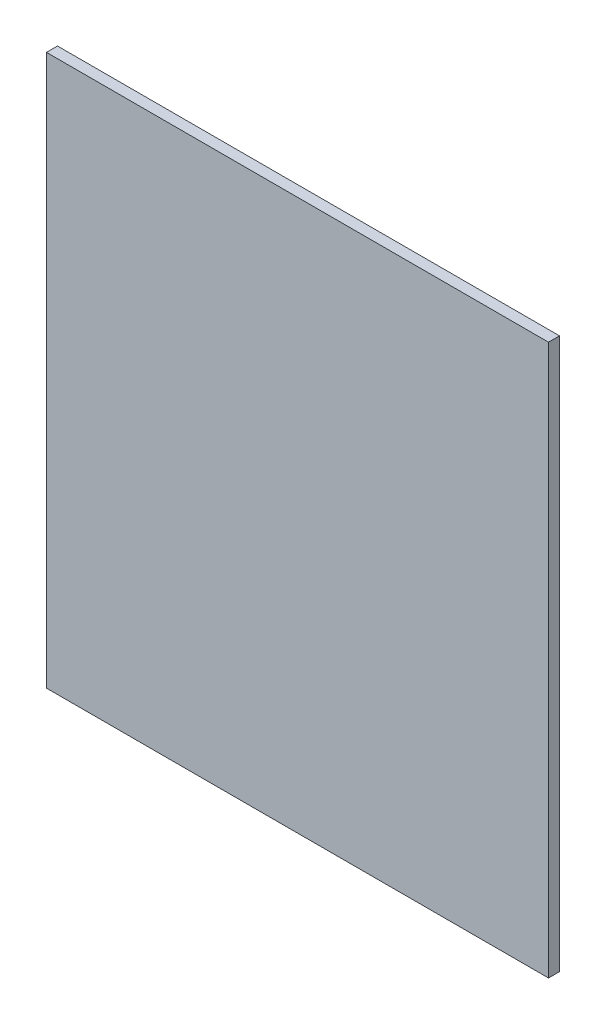
ISO-10303-21;
HEADER;
FILE_DESCRIPTION(('STEP AP214'),'2;1');
FILE_NAME('part.step','',(''),(''),'','','');
FILE_SCHEMA(('AUTOMOTIVE_DESIGN { 1 0 10303 214 1 1 1 1 }'));
ENDSEC;
DATA;
#1=APPLICATION_CONTEXT('core data for automotive mechanical design processes');
#2=APPLICATION_PROTOCOL_DEFINITION('international standard','automotive_design',2000,#1);
#3=PRODUCT_CONTEXT('',#1,'mechanical');
#4=PRODUCT('Part','Part','',(#3));
#5=PRODUCT_RELATED_PRODUCT_CATEGORY('part','',(#4));
#6=PRODUCT_DEFINITION_FORMATION('','',#4);
#7=PRODUCT_DEFINITION_CONTEXT('part definition',#1,'design');
#8=PRODUCT_DEFINITION('design','',#6,#7);
#9=PRODUCT_DEFINITION_SHAPE('','',#8);
#10=(LENGTH_UNIT() NAMED_UNIT(*) SI_UNIT(.MILLI.,.METRE.));
#11=(NAMED_UNIT(*) PLANE_ANGLE_UNIT() SI_UNIT($,.RADIAN.));
#12=(NAMED_UNIT(*) SI_UNIT($,.STERADIAN.) SOLID_ANGLE_UNIT());
#13=UNCERTAINTY_MEASURE_WITH_UNIT(LENGTH_MEASURE(1.E-05),#10,'distance_accuracy_value','');
#14=(GEOMETRIC_REPRESENTATION_CONTEXT(3) GLOBAL_UNCERTAINTY_ASSIGNED_CONTEXT((#13)) GLOBAL_UNIT_ASSIGNED_CONTEXT((#10,
#11,#12)) REPRESENTATION_CONTEXT('',''));
#15=CARTESIAN_POINT('',(0.,0.,0.));
#16=DIRECTION('',(0.,0.,1.));
#17=DIRECTION('',(1.,0.,0.));
#18=AXIS2_PLACEMENT_3D('',#15,#16,#17);
#19=CARTESIAN_POINT('',(-68.375,75.,3.));
#20=DIRECTION('',(1.,0.,0.));
#21=DIRECTION('',(0.,1.,0.));
#22=AXIS2_PLACEMENT_3D('',#19,#20,#21);
#23=PLANE('',#22);
#24=DIRECTION('',(0.,-1.,0.));
#25=VECTOR('',#24,1.);
#26=CARTESIAN_POINT('',(-68.375,75.,0.));
#27=LINE('',#26,#25);
#28=CARTESIAN_POINT('',(-68.375,75.,0.));
#29=VERTEX_POINT('',#28);
#30=CARTESIAN_POINT('',(-68.375,-75.,0.));
#31=VERTEX_POINT('',#30);
#32=EDGE_CURVE('E107',#29,#31,#27,.T.);
#33=ORIENTED_EDGE('',*,*,#32,.T.);
#34=DIRECTION('',(0.,0.,-1.));
#35=VECTOR('',#34,1.);
#36=CARTESIAN_POINT('',(-68.375,-75.,3.));
#37=LINE('',#36,#35);
#38=CARTESIAN_POINT('',(-68.375,-75.,3.));
#39=VERTEX_POINT('',#38);
#40=EDGE_CURVE('E11',#39,#31,#37,.T.);
#41=ORIENTED_EDGE('',*,*,#40,.F.);
#42=DIRECTION('',(0.,-1.,0.));
#43=VECTOR('',#42,1.);
#44=CARTESIAN_POINT('',(-68.375,75.,3.));
#45=LINE('',#44,#43);
#46=CARTESIAN_POINT('',(-68.375,75.,3.));
#47=VERTEX_POINT('',#46);
#48=EDGE_CURVE('E91',#47,#39,#45,.T.);
#49=ORIENTED_EDGE('',*,*,#48,.F.);
#50=DIRECTION('',(0.,0.,-1.));
#51=VECTOR('',#50,1.);
#52=CARTESIAN_POINT('',(-68.375,75.,3.));
#53=LINE('',#52,#51);
#54=EDGE_CURVE('E103',#47,#29,#53,.T.);
#55=ORIENTED_EDGE('',*,*,#54,.T.);
#56=EDGE_LOOP('',(#33,#41,#49,#55));
#57=FACE_BOUND('',#56,.T.);
#58=ADVANCED_FACE('F39',(#57),#23,.F.);
#59=CARTESIAN_POINT('',(-68.375,-75.,3.));
#60=DIRECTION('',(0.,1.,0.));
#61=DIRECTION('',(0.,0.,1.));
#62=AXIS2_PLACEMENT_3D('',#59,#60,#61);
#63=PLANE('',#62);
#64=DIRECTION('',(1.,0.,0.));
#65=VECTOR('',#64,1.);
#66=CARTESIAN_POINT('',(-68.375,-75.,0.));
#67=LINE('',#66,#65);
#68=CARTESIAN_POINT('',(68.375,-75.,0.));
#69=VERTEX_POINT('',#68);
#70=EDGE_CURVE('E96',#31,#69,#67,.T.);
#71=ORIENTED_EDGE('',*,*,#70,.T.);
#72=DIRECTION('',(0.,0.,-1.));
#73=VECTOR('',#72,1.);
#74=CARTESIAN_POINT('',(68.375,-75.,3.));
#75=LINE('',#74,#73);
#76=CARTESIAN_POINT('',(68.375,-75.,3.));
#77=VERTEX_POINT('',#76);
#78=EDGE_CURVE('E48',#77,#69,#75,.T.);
#79=ORIENTED_EDGE('',*,*,#78,.F.);
#80=DIRECTION('',(1.,0.,0.));
#81=VECTOR('',#80,1.);
#82=CARTESIAN_POINT('',(-68.375,-75.,3.));
#83=LINE('',#82,#81);
#84=EDGE_CURVE('E86',#39,#77,#83,.T.);
#85=ORIENTED_EDGE('',*,*,#84,.F.);
#86=ORIENTED_EDGE('',*,*,#40,.T.);
#87=EDGE_LOOP('',(#71,#79,#85,#86));
#88=FACE_BOUND('',#87,.T.);
#89=ADVANCED_FACE('F95',(#88),#63,.F.);
#90=CARTESIAN_POINT('',(68.375,75.,3.));
#91=DIRECTION('',(-1.,0.,0.));
#92=DIRECTION('',(0.,-1.,0.));
#93=AXIS2_PLACEMENT_3D('',#90,#91,#92);
#94=PLANE('',#93);
#95=DIRECTION('',(0.,1.,0.));
#96=VECTOR('',#95,1.);
#97=CARTESIAN_POINT('',(68.375,75.,0.));
#98=LINE('',#97,#96);
#99=CARTESIAN_POINT('',(68.375,75.,0.));
#100=VERTEX_POINT('',#99);
#101=EDGE_CURVE('E73',#69,#100,#98,.T.);
#102=ORIENTED_EDGE('',*,*,#101,.T.);
#103=DIRECTION('',(0.,0.,-1.));
#104=VECTOR('',#103,1.);
#105=CARTESIAN_POINT('',(68.375,75.,3.));
#106=LINE('',#105,#104);
#107=CARTESIAN_POINT('',(68.375,75.,3.));
#108=VERTEX_POINT('',#107);
#109=EDGE_CURVE('E98',#108,#100,#106,.T.);
#110=ORIENTED_EDGE('',*,*,#109,.F.);
#111=DIRECTION('',(0.,1.,0.));
#112=VECTOR('',#111,1.);
#113=CARTESIAN_POINT('',(68.375,75.,3.));
#114=LINE('',#113,#112);
#115=EDGE_CURVE('E89',#77,#108,#114,.T.);
#116=ORIENTED_EDGE('',*,*,#115,.F.);
#117=ORIENTED_EDGE('',*,*,#78,.T.);
#118=EDGE_LOOP('',(#102,#110,#116,#117));
#119=FACE_BOUND('',#118,.T.);
#120=ADVANCED_FACE('F99',(#119),#94,.F.);
#121=CARTESIAN_POINT('',(-68.375,75.,3.));
#122=DIRECTION('',(0.,-1.,0.));
#123=DIRECTION('',(1.,0.,0.));
#124=AXIS2_PLACEMENT_3D('',#121,#122,#123);
#125=PLANE('',#124);
#126=DIRECTION('',(-1.,0.,0.));
#127=VECTOR('',#126,1.);
#128=CARTESIAN_POINT('',(-68.375,75.,0.));
#129=LINE('',#128,#127);
#130=EDGE_CURVE('E79',#100,#29,#129,.T.);
#131=ORIENTED_EDGE('',*,*,#130,.T.);
#132=ORIENTED_EDGE('',*,*,#54,.F.);
#133=DIRECTION('',(-1.,0.,0.));
#134=VECTOR('',#133,1.);
#135=CARTESIAN_POINT('',(-68.375,75.,3.));
#136=LINE('',#135,#134);
#137=EDGE_CURVE('E56',#108,#47,#136,.T.);
#138=ORIENTED_EDGE('',*,*,#137,.F.);
#139=ORIENTED_EDGE('',*,*,#109,.T.);
#140=EDGE_LOOP('',(#131,#132,#138,#139));
#141=FACE_BOUND('',#140,.T.);
#142=ADVANCED_FACE('F120',(#141),#125,.F.);
#143=CARTESIAN_POINT('',(0.,0.,3.));
#144=DIRECTION('',(0.,0.,1.));
#145=DIRECTION('',(1.,0.,0.));
#146=AXIS2_PLACEMENT_3D('',#143,#144,#145);
#147=PLANE('',#146);
#148=ORIENTED_EDGE('',*,*,#48,.T.);
#149=ORIENTED_EDGE('',*,*,#84,.T.);
#150=ORIENTED_EDGE('',*,*,#115,.T.);
#151=ORIENTED_EDGE('',*,*,#137,.T.);
#152=EDGE_LOOP('',(#148,#149,#150,#151));
#153=FACE_BOUND('',#152,.T.);
#154=ADVANCED_FACE('F87',(#153),#147,.T.);
#155=CARTESIAN_POINT('',(0.,0.,0.));
#156=DIRECTION('',(0.,0.,1.));
#157=DIRECTION('',(1.,0.,0.));
#158=AXIS2_PLACEMENT_3D('',#155,#156,#157);
#159=PLANE('',#158);
#160=ORIENTED_EDGE('',*,*,#32,.F.);
#161=ORIENTED_EDGE('',*,*,#130,.F.);
#162=ORIENTED_EDGE('',*,*,#101,.F.);
#163=ORIENTED_EDGE('',*,*,#70,.F.);
#164=EDGE_LOOP('',(#160,#161,#162,#163));
#165=FACE_BOUND('',#164,.T.);
#166=ADVANCED_FACE('F123',(#165),#159,.F.);
#167=CLOSED_SHELL('',(#58,#89,#120,#142,#154,#166));
#168=MANIFOLD_SOLID_BREP('B2',#167);
#169=ADVANCED_BREP_SHAPE_REPRESENTATION('',(#18,#168),#14);
#170=SHAPE_DEFINITION_REPRESENTATION(#9,#169);
ENDSEC;
END-ISO-10303-21;
